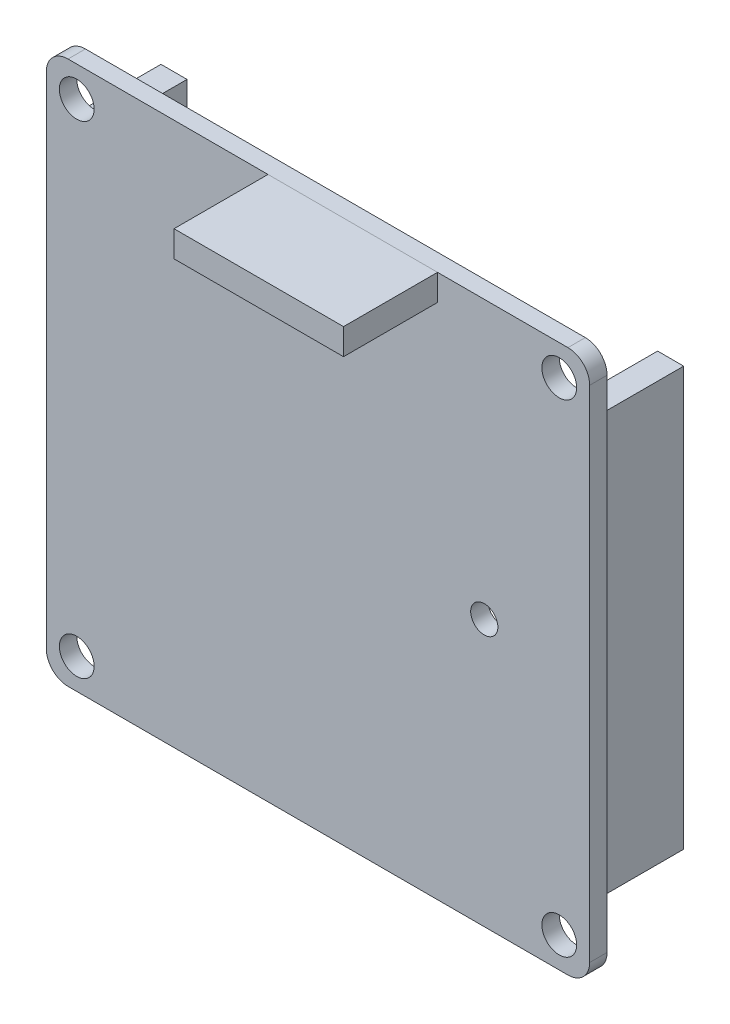
ISO-10303-21;
HEADER;
FILE_DESCRIPTION(('STEP AP214'),'2;1');
FILE_NAME('part.step','',(''),(''),'','','');
FILE_SCHEMA(('AUTOMOTIVE_DESIGN { 1 0 10303 214 1 1 1 1 }'));
ENDSEC;
DATA;
#1=APPLICATION_CONTEXT('core data for automotive mechanical design processes');
#2=APPLICATION_PROTOCOL_DEFINITION('international standard','automotive_design',2000,#1);
#3=PRODUCT_CONTEXT('',#1,'mechanical');
#4=PRODUCT('Part','Part','',(#3));
#5=PRODUCT_RELATED_PRODUCT_CATEGORY('part','',(#4));
#6=PRODUCT_DEFINITION_FORMATION('','',#4);
#7=PRODUCT_DEFINITION_CONTEXT('part definition',#1,'design');
#8=PRODUCT_DEFINITION('design','',#6,#7);
#9=PRODUCT_DEFINITION_SHAPE('','',#8);
#10=(LENGTH_UNIT() NAMED_UNIT(*) SI_UNIT(.MILLI.,.METRE.));
#11=(NAMED_UNIT(*) PLANE_ANGLE_UNIT() SI_UNIT($,.RADIAN.));
#12=(NAMED_UNIT(*) SI_UNIT($,.STERADIAN.) SOLID_ANGLE_UNIT());
#13=UNCERTAINTY_MEASURE_WITH_UNIT(LENGTH_MEASURE(1.E-05),#10,'distance_accuracy_value','');
#14=(GEOMETRIC_REPRESENTATION_CONTEXT(3) GLOBAL_UNCERTAINTY_ASSIGNED_CONTEXT((#13)) GLOBAL_UNIT_ASSIGNED_CONTEXT((#10,
#11,#12)) REPRESENTATION_CONTEXT('',''));
#15=CARTESIAN_POINT('',(0.,0.,0.));
#16=DIRECTION('',(0.,0.,1.));
#17=DIRECTION('',(1.,0.,0.));
#18=AXIS2_PLACEMENT_3D('',#15,#16,#17);
#19=CARTESIAN_POINT('',(15.3,-0.5,1.6));
#20=DIRECTION('',(0.,0.,-1.));
#21=DIRECTION('',(1.,0.,0.));
#22=AXIS2_PLACEMENT_3D('',#19,#20,#21);
#23=CYLINDRICAL_SURFACE('',#22,1.25);
#24=CARTESIAN_POINT('',(15.3,-0.5,1.6));
#25=DIRECTION('',(0.,0.,1.));
#26=DIRECTION('',(1.,0.,0.));
#27=AXIS2_PLACEMENT_3D('',#24,#25,#26);
#28=CIRCLE('',#27,1.25);
#29=CARTESIAN_POINT('',(16.55,-0.5,1.6));
#30=VERTEX_POINT('',#29);
#31=EDGE_CURVE('P0_E195',#30,#30,#28,.T.);
#32=ORIENTED_EDGE('',*,*,#31,.T.);
#33=DIRECTION('',(0.,0.,-1.));
#34=VECTOR('',#33,1.);
#35=CARTESIAN_POINT('',(16.55,-0.5,1.6));
#36=LINE('',#35,#34);
#37=CARTESIAN_POINT('',(16.55,-0.5,0.));
#38=VERTEX_POINT('',#37);
#39=EDGE_CURVE('P0_E11',#30,#38,#36,.T.);
#40=ORIENTED_EDGE('',*,*,#39,.T.);
#41=CARTESIAN_POINT('',(15.3,-0.5,0.));
#42=DIRECTION('',(0.,0.,-1.));
#43=DIRECTION('',(1.,0.,0.));
#44=AXIS2_PLACEMENT_3D('',#41,#42,#43);
#45=CIRCLE('',#44,1.25);
#46=EDGE_CURVE('P0_E196',#38,#38,#45,.T.);
#47=ORIENTED_EDGE('',*,*,#46,.T.);
#48=ORIENTED_EDGE('',*,*,#39,.F.);
#49=EDGE_LOOP('',(#32,#40,#47,#48));
#50=FACE_BOUND('',#49,.T.);
#51=ADVANCED_FACE('P0_F16',(#50),#23,.F.);
#52=CARTESIAN_POINT('',(-22.2,-22.2,1.6));
#53=DIRECTION('',(0.,0.,-1.));
#54=DIRECTION('',(1.,0.,0.));
#55=AXIS2_PLACEMENT_3D('',#52,#53,#54);
#56=CYLINDRICAL_SURFACE('',#55,1.6);
#57=CARTESIAN_POINT('',(-22.2,-22.2,1.6));
#58=DIRECTION('',(0.,0.,1.));
#59=DIRECTION('',(1.,0.,0.));
#60=AXIS2_PLACEMENT_3D('',#57,#58,#59);
#61=CIRCLE('',#60,1.6);
#62=CARTESIAN_POINT('',(-20.6,-22.2,1.6));
#63=VERTEX_POINT('',#62);
#64=EDGE_CURVE('P0_E193',#63,#63,#61,.T.);
#65=ORIENTED_EDGE('',*,*,#64,.T.);
#66=DIRECTION('',(0.,0.,-1.));
#67=VECTOR('',#66,1.);
#68=CARTESIAN_POINT('',(-20.6,-22.2,1.6));
#69=LINE('',#68,#67);
#70=CARTESIAN_POINT('',(-20.6,-22.2,0.));
#71=VERTEX_POINT('',#70);
#72=EDGE_CURVE('P0_E24',#63,#71,#69,.T.);
#73=ORIENTED_EDGE('',*,*,#72,.T.);
#74=CARTESIAN_POINT('',(-22.2,-22.2,0.));
#75=DIRECTION('',(0.,0.,1.));
#76=DIRECTION('',(1.,0.,0.));
#77=AXIS2_PLACEMENT_3D('',#74,#75,#76);
#78=CIRCLE('',#77,1.6);
#79=EDGE_CURVE('P0_E153',#71,#71,#78,.T.);
#80=ORIENTED_EDGE('',*,*,#79,.F.);
#81=ORIENTED_EDGE('',*,*,#72,.F.);
#82=EDGE_LOOP('',(#65,#73,#80,#81));
#83=FACE_BOUND('',#82,.T.);
#84=ADVANCED_FACE('P0_F263',(#83),#56,.F.);
#85=CARTESIAN_POINT('',(-22.2,22.2,1.6));
#86=DIRECTION('',(0.,0.,-1.));
#87=DIRECTION('',(1.,0.,0.));
#88=AXIS2_PLACEMENT_3D('',#85,#86,#87);
#89=CYLINDRICAL_SURFACE('',#88,1.6);
#90=CARTESIAN_POINT('',(-22.2,22.2,1.6));
#91=DIRECTION('',(0.,0.,1.));
#92=DIRECTION('',(1.,0.,0.));
#93=AXIS2_PLACEMENT_3D('',#90,#91,#92);
#94=CIRCLE('',#93,1.6);
#95=CARTESIAN_POINT('',(-20.6,22.2,1.6));
#96=VERTEX_POINT('',#95);
#97=EDGE_CURVE('P0_E197',#96,#96,#94,.T.);
#98=ORIENTED_EDGE('',*,*,#97,.T.);
#99=DIRECTION('',(0.,0.,-1.));
#100=VECTOR('',#99,1.);
#101=CARTESIAN_POINT('',(-20.6,22.2,1.6));
#102=LINE('',#101,#100);
#103=CARTESIAN_POINT('',(-20.6,22.2,0.));
#104=VERTEX_POINT('',#103);
#105=EDGE_CURVE('P0_E186',#96,#104,#102,.T.);
#106=ORIENTED_EDGE('',*,*,#105,.T.);
#107=CARTESIAN_POINT('',(-22.2,22.2,0.));
#108=DIRECTION('',(0.,0.,1.));
#109=DIRECTION('',(1.,0.,0.));
#110=AXIS2_PLACEMENT_3D('',#107,#108,#109);
#111=CIRCLE('',#110,1.6);
#112=EDGE_CURVE('P0_E231',#104,#104,#111,.T.);
#113=ORIENTED_EDGE('',*,*,#112,.F.);
#114=ORIENTED_EDGE('',*,*,#105,.F.);
#115=EDGE_LOOP('',(#98,#106,#113,#114));
#116=FACE_BOUND('',#115,.T.);
#117=ADVANCED_FACE('P0_F345',(#116),#89,.F.);
#118=CARTESIAN_POINT('',(22.2,22.2,1.6));
#119=DIRECTION('',(0.,0.,-1.));
#120=DIRECTION('',(1.,0.,0.));
#121=AXIS2_PLACEMENT_3D('',#118,#119,#120);
#122=CYLINDRICAL_SURFACE('',#121,1.6);
#123=CARTESIAN_POINT('',(22.2,22.2,1.6));
#124=DIRECTION('',(0.,0.,1.));
#125=DIRECTION('',(1.,0.,0.));
#126=AXIS2_PLACEMENT_3D('',#123,#124,#125);
#127=CIRCLE('',#126,1.6);
#128=CARTESIAN_POINT('',(23.8,22.2,1.6));
#129=VERTEX_POINT('',#128);
#130=EDGE_CURVE('P0_E253',#129,#129,#127,.T.);
#131=ORIENTED_EDGE('',*,*,#130,.T.);
#132=DIRECTION('',(0.,0.,-1.));
#133=VECTOR('',#132,1.);
#134=CARTESIAN_POINT('',(23.8,22.2,1.6));
#135=LINE('',#134,#133);
#136=CARTESIAN_POINT('',(23.8,22.2,0.));
#137=VERTEX_POINT('',#136);
#138=EDGE_CURVE('P0_E188',#129,#137,#135,.T.);
#139=ORIENTED_EDGE('',*,*,#138,.T.);
#140=CARTESIAN_POINT('',(22.2,22.2,0.));
#141=DIRECTION('',(0.,0.,1.));
#142=DIRECTION('',(1.,0.,0.));
#143=AXIS2_PLACEMENT_3D('',#140,#141,#142);
#144=CIRCLE('',#143,1.6);
#145=EDGE_CURVE('P0_E238',#137,#137,#144,.T.);
#146=ORIENTED_EDGE('',*,*,#145,.F.);
#147=ORIENTED_EDGE('',*,*,#138,.F.);
#148=EDGE_LOOP('',(#131,#139,#146,#147));
#149=FACE_BOUND('',#148,.T.);
#150=ADVANCED_FACE('P0_F359',(#149),#122,.F.);
#151=CARTESIAN_POINT('',(22.2,-22.2,1.6));
#152=DIRECTION('',(0.,0.,-1.));
#153=DIRECTION('',(1.,0.,0.));
#154=AXIS2_PLACEMENT_3D('',#151,#152,#153);
#155=CYLINDRICAL_SURFACE('',#154,1.6);
#156=CARTESIAN_POINT('',(22.2,-22.2,1.6));
#157=DIRECTION('',(0.,0.,1.));
#158=DIRECTION('',(1.,0.,0.));
#159=AXIS2_PLACEMENT_3D('',#156,#157,#158);
#160=CIRCLE('',#159,1.6);
#161=CARTESIAN_POINT('',(23.8,-22.2,1.6));
#162=VERTEX_POINT('',#161);
#163=EDGE_CURVE('P0_E248',#162,#162,#160,.T.);
#164=ORIENTED_EDGE('',*,*,#163,.T.);
#165=DIRECTION('',(0.,0.,-1.));
#166=VECTOR('',#165,1.);
#167=CARTESIAN_POINT('',(23.8,-22.2,1.6));
#168=LINE('',#167,#166);
#169=CARTESIAN_POINT('',(23.8,-22.2,0.));
#170=VERTEX_POINT('',#169);
#171=EDGE_CURVE('P0_E43',#162,#170,#168,.T.);
#172=ORIENTED_EDGE('',*,*,#171,.T.);
#173=CARTESIAN_POINT('',(22.2,-22.2,0.));
#174=DIRECTION('',(0.,0.,1.));
#175=DIRECTION('',(1.,0.,0.));
#176=AXIS2_PLACEMENT_3D('',#173,#174,#175);
#177=CIRCLE('',#176,1.6);
#178=EDGE_CURVE('P0_E245',#170,#170,#177,.T.);
#179=ORIENTED_EDGE('',*,*,#178,.F.);
#180=ORIENTED_EDGE('',*,*,#171,.F.);
#181=EDGE_LOOP('',(#164,#172,#179,#180));
#182=FACE_BOUND('',#181,.T.);
#183=ADVANCED_FACE('P0_F348',(#182),#155,.F.);
#184=CARTESIAN_POINT('',(0.,0.,1.6));
#185=DIRECTION('',(0.,0.,1.));
#186=DIRECTION('',(1.,0.,0.));
#187=AXIS2_PLACEMENT_3D('',#184,#185,#186);
#188=PLANE('',#187);
#189=ORIENTED_EDGE('',*,*,#31,.F.);
#190=EDGE_LOOP('',(#189));
#191=FACE_BOUND('',#190,.T.);
#192=ORIENTED_EDGE('',*,*,#163,.F.);
#193=EDGE_LOOP('',(#192));
#194=FACE_BOUND('',#193,.T.);
#195=ORIENTED_EDGE('',*,*,#130,.F.);
#196=EDGE_LOOP('',(#195));
#197=FACE_BOUND('',#196,.T.);
#198=ORIENTED_EDGE('',*,*,#97,.F.);
#199=EDGE_LOOP('',(#198));
#200=FACE_BOUND('',#199,.T.);
#201=ORIENTED_EDGE('',*,*,#64,.F.);
#202=EDGE_LOOP('',(#201));
#203=FACE_BOUND('',#202,.T.);
#204=DIRECTION('',(1.,0.,0.));
#205=VECTOR('',#204,1.);
#206=CARTESIAN_POINT('',(-23.,-25.,1.6));
#207=LINE('',#206,#205);
#208=CARTESIAN_POINT('',(-23.,-25.,1.6));
#209=VERTEX_POINT('',#208);
#210=CARTESIAN_POINT('',(23.,-25.,1.6));
#211=VERTEX_POINT('',#210);
#212=EDGE_CURVE('P0_E280',#209,#211,#207,.T.);
#213=ORIENTED_EDGE('',*,*,#212,.T.);
#214=CARTESIAN_POINT('',(23.,-23.,1.6));
#215=DIRECTION('',(0.,0.,1.));
#216=DIRECTION('',(0.,-1.,0.));
#217=AXIS2_PLACEMENT_3D('',#214,#215,#216);
#218=CIRCLE('',#217,2.);
#219=CARTESIAN_POINT('',(25.,-23.,1.6));
#220=VERTEX_POINT('',#219);
#221=EDGE_CURVE('P0_E220',#211,#220,#218,.T.);
#222=ORIENTED_EDGE('',*,*,#221,.T.);
#223=DIRECTION('',(0.,1.,0.));
#224=VECTOR('',#223,1.);
#225=CARTESIAN_POINT('',(25.,-23.,1.6));
#226=LINE('',#225,#224);
#227=CARTESIAN_POINT('',(25.,23.,1.6));
#228=VERTEX_POINT('',#227);
#229=EDGE_CURVE('P0_E184',#220,#228,#226,.T.);
#230=ORIENTED_EDGE('',*,*,#229,.T.);
#231=CARTESIAN_POINT('',(23.,23.,1.6));
#232=DIRECTION('',(0.,0.,1.));
#233=DIRECTION('',(1.,0.,0.));
#234=AXIS2_PLACEMENT_3D('',#231,#232,#233);
#235=CIRCLE('',#234,2.);
#236=CARTESIAN_POINT('',(23.,25.,1.6));
#237=VERTEX_POINT('',#236);
#238=EDGE_CURVE('P0_E222',#228,#237,#235,.T.);
#239=ORIENTED_EDGE('',*,*,#238,.T.);
#240=DIRECTION('',(-1.,0.,0.));
#241=VECTOR('',#240,1.);
#242=CARTESIAN_POINT('',(23.,25.,1.6));
#243=LINE('',#242,#241);
#244=CARTESIAN_POINT('',(-23.,25.,1.6));
#245=VERTEX_POINT('',#244);
#246=EDGE_CURVE('P0_E209',#237,#245,#243,.T.);
#247=ORIENTED_EDGE('',*,*,#246,.T.);
#248=CARTESIAN_POINT('',(-23.,23.,1.6));
#249=DIRECTION('',(0.,0.,1.));
#250=DIRECTION('',(0.,1.,0.));
#251=AXIS2_PLACEMENT_3D('',#248,#249,#250);
#252=CIRCLE('',#251,2.);
#253=CARTESIAN_POINT('',(-25.,23.,1.6));
#254=VERTEX_POINT('',#253);
#255=EDGE_CURVE('P0_E159',#245,#254,#252,.T.);
#256=ORIENTED_EDGE('',*,*,#255,.T.);
#257=DIRECTION('',(0.,-1.,0.));
#258=VECTOR('',#257,1.);
#259=CARTESIAN_POINT('',(-25.,23.,1.6));
#260=LINE('',#259,#258);
#261=CARTESIAN_POINT('',(-25.,-23.,1.6));
#262=VERTEX_POINT('',#261);
#263=EDGE_CURVE('P0_E160',#254,#262,#260,.T.);
#264=ORIENTED_EDGE('',*,*,#263,.T.);
#265=CARTESIAN_POINT('',(-23.,-23.,1.6));
#266=DIRECTION('',(0.,0.,1.));
#267=DIRECTION('',(-1.,0.,0.));
#268=AXIS2_PLACEMENT_3D('',#265,#266,#267);
#269=CIRCLE('',#268,2.);
#270=EDGE_CURVE('P0_E143',#262,#209,#269,.T.);
#271=ORIENTED_EDGE('',*,*,#270,.T.);
#272=EDGE_LOOP('',(#213,#222,#230,#239,#247,#256,#264,#271));
#273=FACE_BOUND('',#272,.T.);
#274=ADVANCED_FACE('P0_F158',(#191,#194,#197,#200,#203,#273),#188,.T.);
#275=CARTESIAN_POINT('',(0.,0.,0.));
#276=DIRECTION('',(0.,0.,1.));
#277=DIRECTION('',(1.,0.,0.));
#278=AXIS2_PLACEMENT_3D('',#275,#276,#277);
#279=PLANE('',#278);
#280=ORIENTED_EDGE('',*,*,#46,.F.);
#281=EDGE_LOOP('',(#280));
#282=FACE_BOUND('',#281,.T.);
#283=ORIENTED_EDGE('',*,*,#178,.T.);
#284=EDGE_LOOP('',(#283));
#285=FACE_BOUND('',#284,.T.);
#286=ORIENTED_EDGE('',*,*,#145,.T.);
#287=EDGE_LOOP('',(#286));
#288=FACE_BOUND('',#287,.T.);
#289=ORIENTED_EDGE('',*,*,#112,.T.);
#290=EDGE_LOOP('',(#289));
#291=FACE_BOUND('',#290,.T.);
#292=ORIENTED_EDGE('',*,*,#79,.T.);
#293=EDGE_LOOP('',(#292));
#294=FACE_BOUND('',#293,.T.);
#295=CARTESIAN_POINT('',(-23.,-23.,0.));
#296=DIRECTION('',(0.,0.,1.));
#297=DIRECTION('',(-1.,0.,0.));
#298=AXIS2_PLACEMENT_3D('',#295,#296,#297);
#299=CIRCLE('',#298,2.);
#300=CARTESIAN_POINT('',(-25.,-23.,0.));
#301=VERTEX_POINT('',#300);
#302=CARTESIAN_POINT('',(-23.,-25.,0.));
#303=VERTEX_POINT('',#302);
#304=EDGE_CURVE('P0_E152',#301,#303,#299,.T.);
#305=ORIENTED_EDGE('',*,*,#304,.F.);
#306=DIRECTION('',(0.,-1.,0.));
#307=VECTOR('',#306,1.);
#308=CARTESIAN_POINT('',(-25.,23.,0.));
#309=LINE('',#308,#307);
#310=CARTESIAN_POINT('',(-25.,23.,0.));
#311=VERTEX_POINT('',#310);
#312=EDGE_CURVE('P0_E166',#311,#301,#309,.T.);
#313=ORIENTED_EDGE('',*,*,#312,.F.);
#314=CARTESIAN_POINT('',(-23.,23.,0.));
#315=DIRECTION('',(0.,0.,1.));
#316=DIRECTION('',(0.,1.,0.));
#317=AXIS2_PLACEMENT_3D('',#314,#315,#316);
#318=CIRCLE('',#317,2.);
#319=CARTESIAN_POINT('',(-23.,25.,0.));
#320=VERTEX_POINT('',#319);
#321=EDGE_CURVE('P0_E221',#320,#311,#318,.T.);
#322=ORIENTED_EDGE('',*,*,#321,.F.);
#323=DIRECTION('',(-1.,0.,0.));
#324=VECTOR('',#323,1.);
#325=CARTESIAN_POINT('',(23.,25.,0.));
#326=LINE('',#325,#324);
#327=CARTESIAN_POINT('',(23.,25.,0.));
#328=VERTEX_POINT('',#327);
#329=EDGE_CURVE('P0_E206',#328,#320,#326,.T.);
#330=ORIENTED_EDGE('',*,*,#329,.F.);
#331=CARTESIAN_POINT('',(23.,23.,0.));
#332=DIRECTION('',(0.,0.,1.));
#333=DIRECTION('',(1.,0.,0.));
#334=AXIS2_PLACEMENT_3D('',#331,#332,#333);
#335=CIRCLE('',#334,2.);
#336=CARTESIAN_POINT('',(25.,23.,0.));
#337=VERTEX_POINT('',#336);
#338=EDGE_CURVE('P0_E219',#337,#328,#335,.T.);
#339=ORIENTED_EDGE('',*,*,#338,.F.);
#340=DIRECTION('',(0.,1.,0.));
#341=VECTOR('',#340,1.);
#342=CARTESIAN_POINT('',(25.,-23.,0.));
#343=LINE('',#342,#341);
#344=CARTESIAN_POINT('',(25.,-23.,0.));
#345=VERTEX_POINT('',#344);
#346=EDGE_CURVE('P0_E178',#345,#337,#343,.T.);
#347=ORIENTED_EDGE('',*,*,#346,.F.);
#348=CARTESIAN_POINT('',(23.,-23.,0.));
#349=DIRECTION('',(0.,0.,1.));
#350=DIRECTION('',(0.,-1.,0.));
#351=AXIS2_PLACEMENT_3D('',#348,#349,#350);
#352=CIRCLE('',#351,2.);
#353=CARTESIAN_POINT('',(23.,-25.,0.));
#354=VERTEX_POINT('',#353);
#355=EDGE_CURVE('P0_E212',#354,#345,#352,.T.);
#356=ORIENTED_EDGE('',*,*,#355,.F.);
#357=DIRECTION('',(1.,0.,0.));
#358=VECTOR('',#357,1.);
#359=CARTESIAN_POINT('',(-23.,-25.,0.));
#360=LINE('',#359,#358);
#361=EDGE_CURVE('P0_E272',#303,#354,#360,.T.);
#362=ORIENTED_EDGE('',*,*,#361,.F.);
#363=EDGE_LOOP('',(#305,#313,#322,#330,#339,#347,#356,#362));
#364=FACE_BOUND('',#363,.T.);
#365=ADVANCED_FACE('P0_F266',(#282,#285,#288,#291,#294,#364),#279,.F.);
#366=CARTESIAN_POINT('',(-23.,-23.,0.));
#367=DIRECTION('',(0.,0.,1.));
#368=DIRECTION('',(-1.,0.,0.));
#369=AXIS2_PLACEMENT_3D('',#366,#367,#368);
#370=CYLINDRICAL_SURFACE('',#369,2.);
#371=ORIENTED_EDGE('',*,*,#304,.T.);
#372=DIRECTION('',(0.,0.,1.));
#373=VECTOR('',#372,1.);
#374=CARTESIAN_POINT('',(-23.,-25.,0.));
#375=LINE('',#374,#373);
#376=EDGE_CURVE('P0_E146',#303,#209,#375,.T.);
#377=ORIENTED_EDGE('',*,*,#376,.T.);
#378=ORIENTED_EDGE('',*,*,#270,.F.);
#379=DIRECTION('',(0.,0.,1.));
#380=VECTOR('',#379,1.);
#381=CARTESIAN_POINT('',(-25.,-23.,0.));
#382=LINE('',#381,#380);
#383=EDGE_CURVE('P0_E144',#301,#262,#382,.T.);
#384=ORIENTED_EDGE('',*,*,#383,.F.);
#385=EDGE_LOOP('',(#371,#377,#378,#384));
#386=FACE_BOUND('',#385,.T.);
#387=ADVANCED_FACE('P0_F141',(#386),#370,.T.);
#388=CARTESIAN_POINT('',(-23.,23.,0.));
#389=DIRECTION('',(0.,0.,1.));
#390=DIRECTION('',(0.,1.,0.));
#391=AXIS2_PLACEMENT_3D('',#388,#389,#390);
#392=CYLINDRICAL_SURFACE('',#391,2.);
#393=ORIENTED_EDGE('',*,*,#321,.T.);
#394=DIRECTION('',(0.,0.,1.));
#395=VECTOR('',#394,1.);
#396=CARTESIAN_POINT('',(-25.,23.,0.));
#397=LINE('',#396,#395);
#398=EDGE_CURVE('P0_E164',#311,#254,#397,.T.);
#399=ORIENTED_EDGE('',*,*,#398,.T.);
#400=ORIENTED_EDGE('',*,*,#255,.F.);
#401=DIRECTION('',(0.,0.,1.));
#402=VECTOR('',#401,1.);
#403=CARTESIAN_POINT('',(-23.,25.,0.));
#404=LINE('',#403,#402);
#405=EDGE_CURVE('P0_E215',#320,#245,#404,.T.);
#406=ORIENTED_EDGE('',*,*,#405,.F.);
#407=EDGE_LOOP('',(#393,#399,#400,#406));
#408=FACE_BOUND('',#407,.T.);
#409=ADVANCED_FACE('P0_F313',(#408),#392,.T.);
#410=CARTESIAN_POINT('',(23.,23.,0.));
#411=DIRECTION('',(0.,0.,1.));
#412=DIRECTION('',(1.,0.,0.));
#413=AXIS2_PLACEMENT_3D('',#410,#411,#412);
#414=CYLINDRICAL_SURFACE('',#413,2.);
#415=ORIENTED_EDGE('',*,*,#338,.T.);
#416=DIRECTION('',(0.,0.,1.));
#417=VECTOR('',#416,1.);
#418=CARTESIAN_POINT('',(23.,25.,0.));
#419=LINE('',#418,#417);
#420=EDGE_CURVE('P0_E177',#328,#237,#419,.T.);
#421=ORIENTED_EDGE('',*,*,#420,.T.);
#422=ORIENTED_EDGE('',*,*,#238,.F.);
#423=DIRECTION('',(0.,0.,1.));
#424=VECTOR('',#423,1.);
#425=CARTESIAN_POINT('',(25.,23.,0.));
#426=LINE('',#425,#424);
#427=EDGE_CURVE('P0_E181',#337,#228,#426,.T.);
#428=ORIENTED_EDGE('',*,*,#427,.F.);
#429=EDGE_LOOP('',(#415,#421,#422,#428));
#430=FACE_BOUND('',#429,.T.);
#431=ADVANCED_FACE('P0_F321',(#430),#414,.T.);
#432=CARTESIAN_POINT('',(23.,-23.,0.));
#433=DIRECTION('',(0.,0.,1.));
#434=DIRECTION('',(0.,-1.,0.));
#435=AXIS2_PLACEMENT_3D('',#432,#433,#434);
#436=CYLINDRICAL_SURFACE('',#435,2.);
#437=ORIENTED_EDGE('',*,*,#355,.T.);
#438=DIRECTION('',(0.,0.,1.));
#439=VECTOR('',#438,1.);
#440=CARTESIAN_POINT('',(25.,-23.,0.));
#441=LINE('',#440,#439);
#442=EDGE_CURVE('P0_E203',#345,#220,#441,.T.);
#443=ORIENTED_EDGE('',*,*,#442,.T.);
#444=ORIENTED_EDGE('',*,*,#221,.F.);
#445=DIRECTION('',(0.,0.,1.));
#446=VECTOR('',#445,1.);
#447=CARTESIAN_POINT('',(23.,-25.,0.));
#448=LINE('',#447,#446);
#449=EDGE_CURVE('P0_E282',#354,#211,#448,.T.);
#450=ORIENTED_EDGE('',*,*,#449,.F.);
#451=EDGE_LOOP('',(#437,#443,#444,#450));
#452=FACE_BOUND('',#451,.T.);
#453=ADVANCED_FACE('P0_F327',(#452),#436,.T.);
#454=CARTESIAN_POINT('',(-25.,0.,0.8));
#455=DIRECTION('',(-1.,0.,0.));
#456=DIRECTION('',(0.,1.,0.));
#457=AXIS2_PLACEMENT_3D('',#454,#455,#456);
#458=PLANE('',#457);
#459=ORIENTED_EDGE('',*,*,#312,.T.);
#460=ORIENTED_EDGE('',*,*,#383,.T.);
#461=ORIENTED_EDGE('',*,*,#263,.F.);
#462=ORIENTED_EDGE('',*,*,#398,.F.);
#463=EDGE_LOOP('',(#459,#460,#461,#462));
#464=FACE_BOUND('',#463,.T.);
#465=ADVANCED_FACE('P0_F170',(#464),#458,.T.);
#466=CARTESIAN_POINT('',(0.,25.,0.8));
#467=DIRECTION('',(0.,1.,0.));
#468=DIRECTION('',(1.,0.,0.));
#469=AXIS2_PLACEMENT_3D('',#466,#467,#468);
#470=PLANE('',#469);
#471=ORIENTED_EDGE('',*,*,#329,.T.);
#472=ORIENTED_EDGE('',*,*,#405,.T.);
#473=ORIENTED_EDGE('',*,*,#246,.F.);
#474=ORIENTED_EDGE('',*,*,#420,.F.);
#475=EDGE_LOOP('',(#471,#472,#473,#474));
#476=FACE_BOUND('',#475,.T.);
#477=ADVANCED_FACE('P0_F318',(#476),#470,.T.);
#478=CARTESIAN_POINT('',(25.,0.,0.8));
#479=DIRECTION('',(1.,0.,0.));
#480=DIRECTION('',(0.,1.,0.));
#481=AXIS2_PLACEMENT_3D('',#478,#479,#480);
#482=PLANE('',#481);
#483=ORIENTED_EDGE('',*,*,#346,.T.);
#484=ORIENTED_EDGE('',*,*,#427,.T.);
#485=ORIENTED_EDGE('',*,*,#229,.F.);
#486=ORIENTED_EDGE('',*,*,#442,.F.);
#487=EDGE_LOOP('',(#483,#484,#485,#486));
#488=FACE_BOUND('',#487,.T.);
#489=ADVANCED_FACE('P0_F324',(#488),#482,.T.);
#490=CARTESIAN_POINT('',(0.,-25.,0.8));
#491=DIRECTION('',(0.,-1.,0.));
#492=DIRECTION('',(0.,0.,-1.));
#493=AXIS2_PLACEMENT_3D('',#490,#491,#492);
#494=PLANE('',#493);
#495=ORIENTED_EDGE('',*,*,#361,.T.);
#496=ORIENTED_EDGE('',*,*,#449,.T.);
#497=ORIENTED_EDGE('',*,*,#212,.F.);
#498=ORIENTED_EDGE('',*,*,#376,.F.);
#499=EDGE_LOOP('',(#495,#496,#497,#498));
#500=FACE_BOUND('',#499,.T.);
#501=ADVANCED_FACE('P0_F274',(#500),#494,.T.);
#502=CLOSED_SHELL('',(#51,#84,#117,#150,#183,#274,#365,#387,#409,#431,#453,#465,#477,#489,#501));
#503=MANIFOLD_SOLID_BREP('P0_B1',#502);
#504=CARTESIAN_POINT('',(-4.6,23.8,5.925));
#505=DIRECTION('',(-1.,0.,0.));
#506=DIRECTION('',(0.,0.,1.));
#507=AXIS2_PLACEMENT_3D('',#504,#505,#506);
#508=PLANE('',#507);
#509=DIRECTION('',(0.,-1.,0.));
#510=VECTOR('',#509,1.);
#511=CARTESIAN_POINT('',(-4.6,25.,1.6));
#512=LINE('',#511,#510);
#513=CARTESIAN_POINT('',(-4.6,25.,1.6));
#514=VERTEX_POINT('',#513);
#515=CARTESIAN_POINT('',(-4.6,22.6,1.6));
#516=VERTEX_POINT('',#515);
#517=EDGE_CURVE('P1_E67',#514,#516,#512,.T.);
#518=ORIENTED_EDGE('',*,*,#517,.T.);
#519=DIRECTION('',(0.,0.,1.));
#520=VECTOR('',#519,1.);
#521=CARTESIAN_POINT('',(-4.6,22.6,1.6));
#522=LINE('',#521,#520);
#523=CARTESIAN_POINT('',(-4.6,22.6,10.25));
#524=VERTEX_POINT('',#523);
#525=EDGE_CURVE('P1_E89',#516,#524,#522,.T.);
#526=ORIENTED_EDGE('',*,*,#525,.T.);
#527=DIRECTION('',(0.,-1.,0.));
#528=VECTOR('',#527,1.);
#529=CARTESIAN_POINT('',(-4.6,25.,10.25));
#530=LINE('',#529,#528);
#531=CARTESIAN_POINT('',(-4.6,25.,10.25));
#532=VERTEX_POINT('',#531);
#533=EDGE_CURVE('P1_E75',#532,#524,#530,.T.);
#534=ORIENTED_EDGE('',*,*,#533,.F.);
#535=DIRECTION('',(0.,0.,1.));
#536=VECTOR('',#535,1.);
#537=CARTESIAN_POINT('',(-4.6,25.,1.6));
#538=LINE('',#537,#536);
#539=EDGE_CURVE('P1_E11',#514,#532,#538,.T.);
#540=ORIENTED_EDGE('',*,*,#539,.F.);
#541=EDGE_LOOP('',(#518,#526,#534,#540));
#542=FACE_BOUND('',#541,.T.);
#543=ADVANCED_FACE('P1_F16',(#542),#508,.T.);
#544=CARTESIAN_POINT('',(3.2,25.,5.925));
#545=DIRECTION('',(0.,1.,0.));
#546=DIRECTION('',(1.,0.,0.));
#547=AXIS2_PLACEMENT_3D('',#544,#545,#546);
#548=PLANE('',#547);
#549=DIRECTION('',(-1.,0.,0.));
#550=VECTOR('',#549,1.);
#551=CARTESIAN_POINT('',(11.,25.,1.6));
#552=LINE('',#551,#550);
#553=CARTESIAN_POINT('',(11.,25.,1.6));
#554=VERTEX_POINT('',#553);
#555=EDGE_CURVE('P1_E72',#554,#514,#552,.T.);
#556=ORIENTED_EDGE('',*,*,#555,.T.);
#557=ORIENTED_EDGE('',*,*,#539,.T.);
#558=DIRECTION('',(-1.,0.,0.));
#559=VECTOR('',#558,1.);
#560=CARTESIAN_POINT('',(11.,25.,10.25));
#561=LINE('',#560,#559);
#562=CARTESIAN_POINT('',(11.,25.,10.25));
#563=VERTEX_POINT('',#562);
#564=EDGE_CURVE('P1_E104',#563,#532,#561,.T.);
#565=ORIENTED_EDGE('',*,*,#564,.F.);
#566=DIRECTION('',(0.,0.,1.));
#567=VECTOR('',#566,1.);
#568=CARTESIAN_POINT('',(11.,25.,1.6));
#569=LINE('',#568,#567);
#570=EDGE_CURVE('P1_E24',#554,#563,#569,.T.);
#571=ORIENTED_EDGE('',*,*,#570,.F.);
#572=EDGE_LOOP('',(#556,#557,#565,#571));
#573=FACE_BOUND('',#572,.T.);
#574=ADVANCED_FACE('P1_F74',(#573),#548,.T.);
#575=CARTESIAN_POINT('',(11.,23.8,5.925));
#576=DIRECTION('',(1.,0.,0.));
#577=DIRECTION('',(0.,1.,0.));
#578=AXIS2_PLACEMENT_3D('',#575,#576,#577);
#579=PLANE('',#578);
#580=DIRECTION('',(0.,1.,0.));
#581=VECTOR('',#580,1.);
#582=CARTESIAN_POINT('',(11.,22.6,1.6));
#583=LINE('',#582,#581);
#584=CARTESIAN_POINT('',(11.,22.6,1.6));
#585=VERTEX_POINT('',#584);
#586=EDGE_CURVE('P1_E78',#585,#554,#583,.T.);
#587=ORIENTED_EDGE('',*,*,#586,.T.);
#588=ORIENTED_EDGE('',*,*,#570,.T.);
#589=DIRECTION('',(0.,1.,0.));
#590=VECTOR('',#589,1.);
#591=CARTESIAN_POINT('',(11.,22.6,10.25));
#592=LINE('',#591,#590);
#593=CARTESIAN_POINT('',(11.,22.6,10.25));
#594=VERTEX_POINT('',#593);
#595=EDGE_CURVE('P1_E101',#594,#563,#592,.T.);
#596=ORIENTED_EDGE('',*,*,#595,.F.);
#597=DIRECTION('',(0.,0.,1.));
#598=VECTOR('',#597,1.);
#599=CARTESIAN_POINT('',(11.,22.6,1.6));
#600=LINE('',#599,#598);
#601=EDGE_CURVE('P1_E95',#585,#594,#600,.T.);
#602=ORIENTED_EDGE('',*,*,#601,.F.);
#603=EDGE_LOOP('',(#587,#588,#596,#602));
#604=FACE_BOUND('',#603,.T.);
#605=ADVANCED_FACE('P1_F123',(#604),#579,.T.);
#606=CARTESIAN_POINT('',(3.2,22.6,5.925));
#607=DIRECTION('',(0.,-1.,0.));
#608=DIRECTION('',(0.,0.,-1.));
#609=AXIS2_PLACEMENT_3D('',#606,#607,#608);
#610=PLANE('',#609);
#611=DIRECTION('',(1.,0.,0.));
#612=VECTOR('',#611,1.);
#613=CARTESIAN_POINT('',(-4.6,22.6,1.6));
#614=LINE('',#613,#612);
#615=EDGE_CURVE('P1_E82',#516,#585,#614,.T.);
#616=ORIENTED_EDGE('',*,*,#615,.T.);
#617=ORIENTED_EDGE('',*,*,#601,.T.);
#618=DIRECTION('',(1.,0.,0.));
#619=VECTOR('',#618,1.);
#620=CARTESIAN_POINT('',(-4.6,22.6,10.25));
#621=LINE('',#620,#619);
#622=EDGE_CURVE('P1_E100',#524,#594,#621,.T.);
#623=ORIENTED_EDGE('',*,*,#622,.F.);
#624=ORIENTED_EDGE('',*,*,#525,.F.);
#625=EDGE_LOOP('',(#616,#617,#623,#624));
#626=FACE_BOUND('',#625,.T.);
#627=ADVANCED_FACE('P1_F150',(#626),#610,.T.);
#628=CARTESIAN_POINT('',(3.2,30.4,10.25));
#629=DIRECTION('',(0.,0.,1.));
#630=DIRECTION('',(1.,0.,0.));
#631=AXIS2_PLACEMENT_3D('',#628,#629,#630);
#632=PLANE('',#631);
#633=ORIENTED_EDGE('',*,*,#622,.T.);
#634=ORIENTED_EDGE('',*,*,#595,.T.);
#635=ORIENTED_EDGE('',*,*,#564,.T.);
#636=ORIENTED_EDGE('',*,*,#533,.T.);
#637=EDGE_LOOP('',(#633,#634,#635,#636));
#638=FACE_BOUND('',#637,.T.);
#639=ADVANCED_FACE('P1_F140',(#638),#632,.T.);
#640=CARTESIAN_POINT('',(3.2,30.4,1.6));
#641=DIRECTION('',(0.,0.,1.));
#642=DIRECTION('',(1.,0.,0.));
#643=AXIS2_PLACEMENT_3D('',#640,#641,#642);
#644=PLANE('',#643);
#645=ORIENTED_EDGE('',*,*,#517,.F.);
#646=ORIENTED_EDGE('',*,*,#555,.F.);
#647=ORIENTED_EDGE('',*,*,#586,.F.);
#648=ORIENTED_EDGE('',*,*,#615,.F.);
#649=EDGE_LOOP('',(#645,#646,#647,#648));
#650=FACE_BOUND('',#649,.T.);
#651=ADVANCED_FACE('P1_F85',(#650),#644,.F.);
#652=CLOSED_SHELL('',(#543,#574,#605,#627,#639,#651));
#653=MANIFOLD_SOLID_BREP('P1_B1',#652);
#654=CARTESIAN_POINT('',(22.85,-19.25,-4.));
#655=DIRECTION('',(0.,-1.,0.));
#656=DIRECTION('',(0.,0.,-1.));
#657=AXIS2_PLACEMENT_3D('',#654,#655,#656);
#658=PLANE('',#657);
#659=DIRECTION('',(-1.,0.,0.));
#660=VECTOR('',#659,1.);
#661=CARTESIAN_POINT('',(24.05,-19.25,0.));
#662=LINE('',#661,#660);
#663=CARTESIAN_POINT('',(24.05,-19.25,0.));
#664=VERTEX_POINT('',#663);
#665=CARTESIAN_POINT('',(21.65,-19.25,0.));
#666=VERTEX_POINT('',#665);
#667=EDGE_CURVE('P2_E69',#664,#666,#662,.T.);
#668=ORIENTED_EDGE('',*,*,#667,.T.);
#669=DIRECTION('',(0.,0.,-1.));
#670=VECTOR('',#669,1.);
#671=CARTESIAN_POINT('',(21.65,-19.25,0.));
#672=LINE('',#671,#670);
#673=CARTESIAN_POINT('',(21.65,-19.25,-8.));
#674=VERTEX_POINT('',#673);
#675=EDGE_CURVE('P2_E105',#666,#674,#672,.T.);
#676=ORIENTED_EDGE('',*,*,#675,.T.);
#677=DIRECTION('',(-1.,0.,0.));
#678=VECTOR('',#677,1.);
#679=CARTESIAN_POINT('',(24.05,-19.25,-8.));
#680=LINE('',#679,#678);
#681=CARTESIAN_POINT('',(24.05,-19.25,-8.));
#682=VERTEX_POINT('',#681);
#683=EDGE_CURVE('P2_E71',#682,#674,#680,.T.);
#684=ORIENTED_EDGE('',*,*,#683,.F.);
#685=DIRECTION('',(0.,0.,-1.));
#686=VECTOR('',#685,1.);
#687=CARTESIAN_POINT('',(24.05,-19.25,0.));
#688=LINE('',#687,#686);
#689=EDGE_CURVE('P2_E11',#664,#682,#688,.T.);
#690=ORIENTED_EDGE('',*,*,#689,.F.);
#691=EDGE_LOOP('',(#668,#676,#684,#690));
#692=FACE_BOUND('',#691,.T.);
#693=ADVANCED_FACE('P2_F16',(#692),#658,.T.);
#694=CARTESIAN_POINT('',(24.05,0.,-4.));
#695=DIRECTION('',(1.,0.,0.));
#696=DIRECTION('',(0.,-1.,0.));
#697=AXIS2_PLACEMENT_3D('',#694,#695,#696);
#698=PLANE('',#697);
#699=DIRECTION('',(0.,-1.,0.));
#700=VECTOR('',#699,1.);
#701=CARTESIAN_POINT('',(24.05,19.25,0.));
#702=LINE('',#701,#700);
#703=CARTESIAN_POINT('',(24.05,19.25,0.));
#704=VERTEX_POINT('',#703);
#705=EDGE_CURVE('P2_E74',#704,#664,#702,.T.);
#706=ORIENTED_EDGE('',*,*,#705,.T.);
#707=ORIENTED_EDGE('',*,*,#689,.T.);
#708=DIRECTION('',(0.,-1.,0.));
#709=VECTOR('',#708,1.);
#710=CARTESIAN_POINT('',(24.05,19.25,-8.));
#711=LINE('',#710,#709);
#712=CARTESIAN_POINT('',(24.05,19.25,-8.));
#713=VERTEX_POINT('',#712);
#714=EDGE_CURVE('P2_E95',#713,#682,#711,.T.);
#715=ORIENTED_EDGE('',*,*,#714,.F.);
#716=DIRECTION('',(0.,0.,-1.));
#717=VECTOR('',#716,1.);
#718=CARTESIAN_POINT('',(24.05,19.25,0.));
#719=LINE('',#718,#717);
#720=EDGE_CURVE('P2_E19',#704,#713,#719,.T.);
#721=ORIENTED_EDGE('',*,*,#720,.F.);
#722=EDGE_LOOP('',(#706,#707,#715,#721));
#723=FACE_BOUND('',#722,.T.);
#724=ADVANCED_FACE('P2_F76',(#723),#698,.T.);
#725=CARTESIAN_POINT('',(22.85,19.25,-4.));
#726=DIRECTION('',(0.,1.,0.));
#727=DIRECTION('',(1.,0.,0.));
#728=AXIS2_PLACEMENT_3D('',#725,#726,#727);
#729=PLANE('',#728);
#730=DIRECTION('',(1.,0.,0.));
#731=VECTOR('',#730,1.);
#732=CARTESIAN_POINT('',(21.65,19.25,0.));
#733=LINE('',#732,#731);
#734=CARTESIAN_POINT('',(21.65,19.25,0.));
#735=VERTEX_POINT('',#734);
#736=EDGE_CURVE('P2_E79',#735,#704,#733,.T.);
#737=ORIENTED_EDGE('',*,*,#736,.T.);
#738=ORIENTED_EDGE('',*,*,#720,.T.);
#739=DIRECTION('',(1.,0.,0.));
#740=VECTOR('',#739,1.);
#741=CARTESIAN_POINT('',(21.65,19.25,-8.));
#742=LINE('',#741,#740);
#743=CARTESIAN_POINT('',(21.65,19.25,-8.));
#744=VERTEX_POINT('',#743);
#745=EDGE_CURVE('P2_E92',#744,#713,#742,.T.);
#746=ORIENTED_EDGE('',*,*,#745,.F.);
#747=DIRECTION('',(0.,0.,-1.));
#748=VECTOR('',#747,1.);
#749=CARTESIAN_POINT('',(21.65,19.25,0.));
#750=LINE('',#749,#748);
#751=EDGE_CURVE('P2_E104',#735,#744,#750,.T.);
#752=ORIENTED_EDGE('',*,*,#751,.F.);
#753=EDGE_LOOP('',(#737,#738,#746,#752));
#754=FACE_BOUND('',#753,.T.);
#755=ADVANCED_FACE('P2_F116',(#754),#729,.T.);
#756=CARTESIAN_POINT('',(21.65,0.,-4.));
#757=DIRECTION('',(-1.,0.,0.));
#758=DIRECTION('',(0.,0.,1.));
#759=AXIS2_PLACEMENT_3D('',#756,#757,#758);
#760=PLANE('',#759);
#761=DIRECTION('',(0.,1.,0.));
#762=VECTOR('',#761,1.);
#763=CARTESIAN_POINT('',(21.65,-19.25,0.));
#764=LINE('',#763,#762);
#765=EDGE_CURVE('P2_E84',#666,#735,#764,.T.);
#766=ORIENTED_EDGE('',*,*,#765,.T.);
#767=ORIENTED_EDGE('',*,*,#751,.T.);
#768=DIRECTION('',(0.,1.,0.));
#769=VECTOR('',#768,1.);
#770=CARTESIAN_POINT('',(21.65,-19.25,-8.));
#771=LINE('',#770,#769);
#772=EDGE_CURVE('P2_E98',#674,#744,#771,.T.);
#773=ORIENTED_EDGE('',*,*,#772,.F.);
#774=ORIENTED_EDGE('',*,*,#675,.F.);
#775=EDGE_LOOP('',(#766,#767,#773,#774));
#776=FACE_BOUND('',#775,.T.);
#777=ADVANCED_FACE('P2_F113',(#776),#760,.T.);
#778=CARTESIAN_POINT('',(4.8,0.,-8.));
#779=DIRECTION('',(0.,0.,-1.));
#780=DIRECTION('',(0.,-1.,0.));
#781=AXIS2_PLACEMENT_3D('',#778,#779,#780);
#782=PLANE('',#781);
#783=ORIENTED_EDGE('',*,*,#772,.T.);
#784=ORIENTED_EDGE('',*,*,#745,.T.);
#785=ORIENTED_EDGE('',*,*,#714,.T.);
#786=ORIENTED_EDGE('',*,*,#683,.T.);
#787=EDGE_LOOP('',(#783,#784,#785,#786));
#788=FACE_BOUND('',#787,.T.);
#789=ADVANCED_FACE('P2_F119',(#788),#782,.T.);
#790=CARTESIAN_POINT('',(4.8,0.,0.));
#791=DIRECTION('',(0.,0.,-1.));
#792=DIRECTION('',(0.,-1.,0.));
#793=AXIS2_PLACEMENT_3D('',#790,#791,#792);
#794=PLANE('',#793);
#795=ORIENTED_EDGE('',*,*,#667,.F.);
#796=ORIENTED_EDGE('',*,*,#705,.F.);
#797=ORIENTED_EDGE('',*,*,#736,.F.);
#798=ORIENTED_EDGE('',*,*,#765,.F.);
#799=EDGE_LOOP('',(#795,#796,#797,#798));
#800=FACE_BOUND('',#799,.T.);
#801=ADVANCED_FACE('P2_F83',(#800),#794,.F.);
#802=CLOSED_SHELL('',(#693,#724,#755,#777,#789,#801));
#803=MANIFOLD_SOLID_BREP('P2_B1',#802);
#804=CARTESIAN_POINT('',(-21.65,0.,-4.));
#805=DIRECTION('',(1.,0.,0.));
#806=DIRECTION('',(0.,1.,0.));
#807=AXIS2_PLACEMENT_3D('',#804,#805,#806);
#808=PLANE('',#807);
#809=DIRECTION('',(0.,-1.,0.));
#810=VECTOR('',#809,1.);
#811=CARTESIAN_POINT('',(-21.65,19.25,0.));
#812=LINE('',#811,#810);
#813=CARTESIAN_POINT('',(-21.65,19.25,0.));
#814=VERTEX_POINT('',#813);
#815=CARTESIAN_POINT('',(-21.65,-19.25,0.));
#816=VERTEX_POINT('',#815);
#817=EDGE_CURVE('P3_E73',#814,#816,#812,.T.);
#818=ORIENTED_EDGE('',*,*,#817,.T.);
#819=DIRECTION('',(0.,0.,-1.));
#820=VECTOR('',#819,1.);
#821=CARTESIAN_POINT('',(-21.65,-19.25,0.));
#822=LINE('',#821,#820);
#823=CARTESIAN_POINT('',(-21.65,-19.25,-8.));
#824=VERTEX_POINT('',#823);
#825=EDGE_CURVE('P3_E68',#816,#824,#822,.T.);
#826=ORIENTED_EDGE('',*,*,#825,.T.);
#827=DIRECTION('',(0.,-1.,0.));
#828=VECTOR('',#827,1.);
#829=CARTESIAN_POINT('',(-21.65,19.25,-8.));
#830=LINE('',#829,#828);
#831=CARTESIAN_POINT('',(-21.65,19.25,-8.));
#832=VERTEX_POINT('',#831);
#833=EDGE_CURVE('P3_E69',#832,#824,#830,.T.);
#834=ORIENTED_EDGE('',*,*,#833,.F.);
#835=DIRECTION('',(0.,0.,-1.));
#836=VECTOR('',#835,1.);
#837=CARTESIAN_POINT('',(-21.65,19.25,0.));
#838=LINE('',#837,#836);
#839=EDGE_CURVE('P3_E10',#814,#832,#838,.T.);
#840=ORIENTED_EDGE('',*,*,#839,.F.);
#841=EDGE_LOOP('',(#818,#826,#834,#840));
#842=FACE_BOUND('',#841,.T.);
#843=ADVANCED_FACE('P3_F15',(#842),#808,.T.);
#844=CARTESIAN_POINT('',(-22.85,19.25,-4.));
#845=DIRECTION('',(0.,1.,0.));
#846=DIRECTION('',(1.,0.,0.));
#847=AXIS2_PLACEMENT_3D('',#844,#845,#846);
#848=PLANE('',#847);
#849=DIRECTION('',(1.,0.,0.));
#850=VECTOR('',#849,1.);
#851=CARTESIAN_POINT('',(-24.05,19.25,0.));
#852=LINE('',#851,#850);
#853=CARTESIAN_POINT('',(-24.05,19.25,0.));
#854=VERTEX_POINT('',#853);
#855=EDGE_CURVE('P3_E179',#854,#814,#852,.T.);
#856=ORIENTED_EDGE('',*,*,#855,.T.);
#857=ORIENTED_EDGE('',*,*,#839,.T.);
#858=DIRECTION('',(1.,0.,0.));
#859=VECTOR('',#858,1.);
#860=CARTESIAN_POINT('',(-24.05,19.25,-8.));
#861=LINE('',#860,#859);
#862=CARTESIAN_POINT('',(-24.05,19.25,-8.));
#863=VERTEX_POINT('',#862);
#864=EDGE_CURVE('P3_E88',#863,#832,#861,.T.);
#865=ORIENTED_EDGE('',*,*,#864,.F.);
#866=DIRECTION('',(0.,0.,-1.));
#867=VECTOR('',#866,1.);
#868=CARTESIAN_POINT('',(-24.05,19.25,0.));
#869=LINE('',#868,#867);
#870=EDGE_CURVE('P3_E24',#854,#863,#869,.T.);
#871=ORIENTED_EDGE('',*,*,#870,.F.);
#872=EDGE_LOOP('',(#856,#857,#865,#871));
#873=FACE_BOUND('',#872,.T.);
#874=ADVANCED_FACE('P3_F17',(#873),#848,.T.);
#875=CARTESIAN_POINT('',(-24.05,0.,-4.));
#876=DIRECTION('',(-1.,0.,0.));
#877=DIRECTION('',(0.,1.,0.));
#878=AXIS2_PLACEMENT_3D('',#875,#876,#877);
#879=PLANE('',#878);
#880=DIRECTION('',(0.,1.,0.));
#881=VECTOR('',#880,1.);
#882=CARTESIAN_POINT('',(-24.05,-19.25,0.));
#883=LINE('',#882,#881);
#884=CARTESIAN_POINT('',(-24.05,-19.25,0.));
#885=VERTEX_POINT('',#884);
#886=EDGE_CURVE('P3_E97',#885,#854,#883,.T.);
#887=ORIENTED_EDGE('',*,*,#886,.T.);
#888=ORIENTED_EDGE('',*,*,#870,.T.);
#889=DIRECTION('',(0.,1.,0.));
#890=VECTOR('',#889,1.);
#891=CARTESIAN_POINT('',(-24.05,-19.25,-8.));
#892=LINE('',#891,#890);
#893=CARTESIAN_POINT('',(-24.05,-19.25,-8.));
#894=VERTEX_POINT('',#893);
#895=EDGE_CURVE('P3_E93',#894,#863,#892,.T.);
#896=ORIENTED_EDGE('',*,*,#895,.F.);
#897=DIRECTION('',(0.,0.,-1.));
#898=VECTOR('',#897,1.);
#899=CARTESIAN_POINT('',(-24.05,-19.25,0.));
#900=LINE('',#899,#898);
#901=EDGE_CURVE('P3_E78',#885,#894,#900,.T.);
#902=ORIENTED_EDGE('',*,*,#901,.F.);
#903=EDGE_LOOP('',(#887,#888,#896,#902));
#904=FACE_BOUND('',#903,.T.);
#905=ADVANCED_FACE('P3_F137',(#904),#879,.T.);
#906=CARTESIAN_POINT('',(-22.85,-19.25,-4.));
#907=DIRECTION('',(0.,-1.,0.));
#908=DIRECTION('',(0.,0.,-1.));
#909=AXIS2_PLACEMENT_3D('',#906,#907,#908);
#910=PLANE('',#909);
#911=DIRECTION('',(-1.,0.,0.));
#912=VECTOR('',#911,1.);
#913=CARTESIAN_POINT('',(-21.65,-19.25,0.));
#914=LINE('',#913,#912);
#915=EDGE_CURVE('P3_E95',#816,#885,#914,.T.);
#916=ORIENTED_EDGE('',*,*,#915,.T.);
#917=ORIENTED_EDGE('',*,*,#901,.T.);
#918=DIRECTION('',(-1.,0.,0.));
#919=VECTOR('',#918,1.);
#920=CARTESIAN_POINT('',(-21.65,-19.25,-8.));
#921=LINE('',#920,#919);
#922=EDGE_CURVE('P3_E84',#824,#894,#921,.T.);
#923=ORIENTED_EDGE('',*,*,#922,.F.);
#924=ORIENTED_EDGE('',*,*,#825,.F.);
#925=EDGE_LOOP('',(#916,#917,#923,#924));
#926=FACE_BOUND('',#925,.T.);
#927=ADVANCED_FACE('P3_F90',(#926),#910,.T.);
#928=CARTESIAN_POINT('',(-40.9,0.,-8.));
#929=DIRECTION('',(0.,0.,-1.));
#930=DIRECTION('',(0.,-1.,0.));
#931=AXIS2_PLACEMENT_3D('',#928,#929,#930);
#932=PLANE('',#931);
#933=ORIENTED_EDGE('',*,*,#922,.T.);
#934=ORIENTED_EDGE('',*,*,#895,.T.);
#935=ORIENTED_EDGE('',*,*,#864,.T.);
#936=ORIENTED_EDGE('',*,*,#833,.T.);
#937=EDGE_LOOP('',(#933,#934,#935,#936));
#938=FACE_BOUND('',#937,.T.);
#939=ADVANCED_FACE('P3_F83',(#938),#932,.T.);
#940=CARTESIAN_POINT('',(-40.9,0.,0.));
#941=DIRECTION('',(0.,0.,-1.));
#942=DIRECTION('',(0.,-1.,0.));
#943=AXIS2_PLACEMENT_3D('',#940,#941,#942);
#944=PLANE('',#943);
#945=ORIENTED_EDGE('',*,*,#817,.F.);
#946=ORIENTED_EDGE('',*,*,#855,.F.);
#947=ORIENTED_EDGE('',*,*,#886,.F.);
#948=ORIENTED_EDGE('',*,*,#915,.F.);
#949=EDGE_LOOP('',(#945,#946,#947,#948));
#950=FACE_BOUND('',#949,.T.);
#951=ADVANCED_FACE('P3_F115',(#950),#944,.F.);
#952=CLOSED_SHELL('',(#843,#874,#905,#927,#939,#951));
#953=MANIFOLD_SOLID_BREP('P3_B1',#952);
#954=ADVANCED_BREP_SHAPE_REPRESENTATION('',(#18,#503,#653,#803,#953),#14);
#955=SHAPE_DEFINITION_REPRESENTATION(#9,#954);
ENDSEC;
END-ISO-10303-21;
